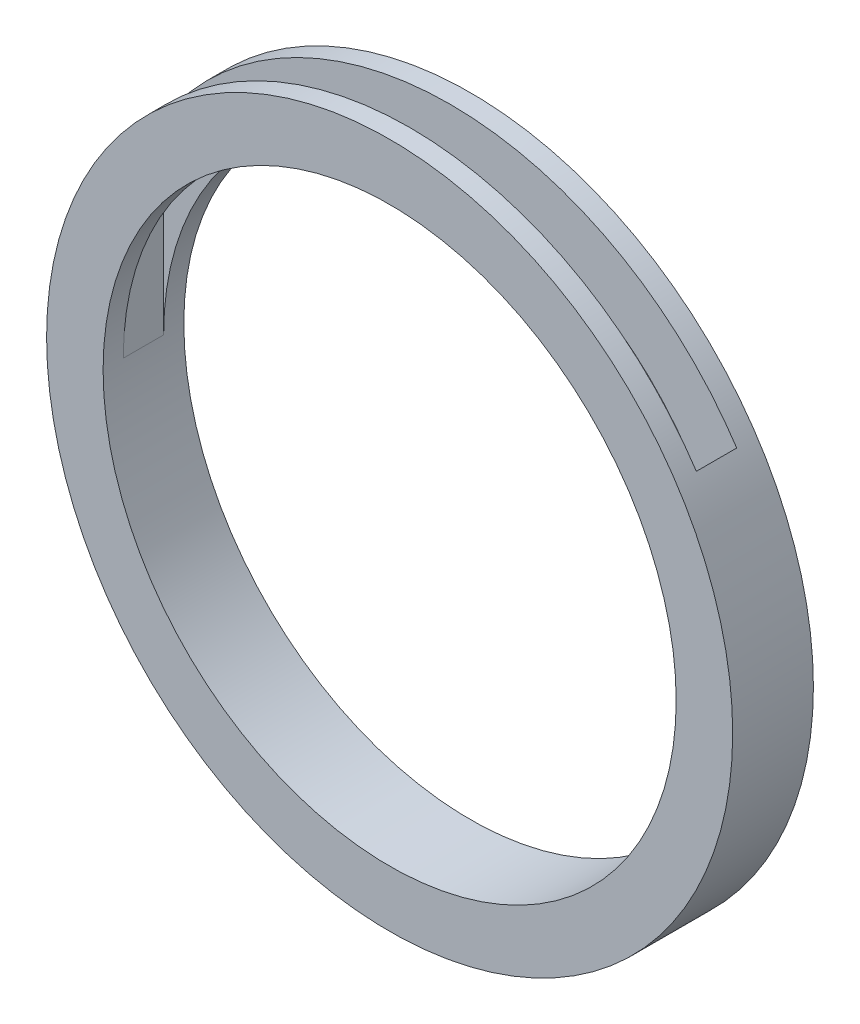
ISO-10303-21;
HEADER;
FILE_DESCRIPTION(('STEP AP214'),'2;1');
FILE_NAME('part.step','',(''),(''),'','','');
FILE_SCHEMA(('AUTOMOTIVE_DESIGN { 1 0 10303 214 1 1 1 1 }'));
ENDSEC;
DATA;
#1=APPLICATION_CONTEXT('core data for automotive mechanical design processes');
#2=APPLICATION_PROTOCOL_DEFINITION('international standard','automotive_design',2000,#1);
#3=PRODUCT_CONTEXT('',#1,'mechanical');
#4=PRODUCT('Part','Part','',(#3));
#5=PRODUCT_RELATED_PRODUCT_CATEGORY('part','',(#4));
#6=PRODUCT_DEFINITION_FORMATION('','',#4);
#7=PRODUCT_DEFINITION_CONTEXT('part definition',#1,'design');
#8=PRODUCT_DEFINITION('design','',#6,#7);
#9=PRODUCT_DEFINITION_SHAPE('','',#8);
#10=(LENGTH_UNIT() NAMED_UNIT(*) SI_UNIT(.MILLI.,.METRE.));
#11=(NAMED_UNIT(*) PLANE_ANGLE_UNIT() SI_UNIT($,.RADIAN.));
#12=(NAMED_UNIT(*) SI_UNIT($,.STERADIAN.) SOLID_ANGLE_UNIT());
#13=UNCERTAINTY_MEASURE_WITH_UNIT(LENGTH_MEASURE(1.E-05),#10,'distance_accuracy_value','');
#14=(GEOMETRIC_REPRESENTATION_CONTEXT(3) GLOBAL_UNCERTAINTY_ASSIGNED_CONTEXT((#13)) GLOBAL_UNIT_ASSIGNED_CONTEXT((#10,
#11,#12)) REPRESENTATION_CONTEXT('',''));
#15=CARTESIAN_POINT('',(0.,0.,0.));
#16=DIRECTION('',(0.,0.,1.));
#17=DIRECTION('',(1.,0.,0.));
#18=AXIS2_PLACEMENT_3D('',#15,#16,#17);
#19=CARTESIAN_POINT('',(21.59,21.59,3.81));
#20=DIRECTION('',(0.,0.,-1.));
#21=DIRECTION('',(-1.,0.,0.));
#22=AXIS2_PLACEMENT_3D('',#19,#20,#21);
#23=PLANE('',#22);
#24=CARTESIAN_POINT('',(0.,0.,3.81));
#25=DIRECTION('',(0.,0.,-1.));
#26=DIRECTION('',(-1.,0.,0.));
#27=AXIS2_PLACEMENT_3D('',#24,#25,#26);
#28=CIRCLE('',#27,21.59);
#29=CARTESIAN_POINT('',(-18.034,11.8702545886767,3.81));
#30=VERTEX_POINT('',#29);
#31=CARTESIAN_POINT('',(18.034,11.8702545886767,3.81));
#32=VERTEX_POINT('',#31);
#33=EDGE_CURVE('E56',#30,#32,#28,.T.);
#34=ORIENTED_EDGE('',*,*,#33,.T.);
#35=DIRECTION('',(0.,-1.,0.));
#36=VECTOR('',#35,1.);
#37=CARTESIAN_POINT('',(18.034,21.591,3.81));
#38=LINE('',#37,#36);
#39=CARTESIAN_POINT('',(18.034,0.,3.81));
#40=VERTEX_POINT('',#39);
#41=EDGE_CURVE('E112',#32,#40,#38,.T.);
#42=ORIENTED_EDGE('',*,*,#41,.T.);
#43=CARTESIAN_POINT('',(0.,0.,3.81));
#44=DIRECTION('',(0.,0.,-1.));
#45=DIRECTION('',(-1.,0.,0.));
#46=AXIS2_PLACEMENT_3D('',#43,#44,#45);
#47=CIRCLE('',#46,18.034);
#48=CARTESIAN_POINT('',(-18.034,0.,3.81));
#49=VERTEX_POINT('',#48);
#50=EDGE_CURVE('E41',#40,#49,#47,.F.);
#51=ORIENTED_EDGE('',*,*,#50,.T.);
#52=DIRECTION('',(0.,-1.,0.));
#53=VECTOR('',#52,1.);
#54=CARTESIAN_POINT('',(-18.034,21.591,3.81));
#55=LINE('',#54,#53);
#56=EDGE_CURVE('E81',#30,#49,#55,.T.);
#57=ORIENTED_EDGE('',*,*,#56,.F.);
#58=EDGE_LOOP('',(#34,#42,#51,#57));
#59=FACE_BOUND('',#58,.T.);
#60=ADVANCED_FACE('F33',(#59),#23,.T.);
#61=CARTESIAN_POINT('',(21.59,21.59,1.27));
#62=DIRECTION('',(0.,0.,1.));
#63=DIRECTION('',(1.,0.,0.));
#64=AXIS2_PLACEMENT_3D('',#61,#62,#63);
#65=PLANE('',#64);
#66=CARTESIAN_POINT('',(0.,0.,1.27));
#67=DIRECTION('',(0.,0.,1.));
#68=DIRECTION('',(1.,0.,0.));
#69=AXIS2_PLACEMENT_3D('',#66,#67,#68);
#70=CIRCLE('',#69,18.034);
#71=CARTESIAN_POINT('',(-18.034,0.,1.27));
#72=VERTEX_POINT('',#71);
#73=CARTESIAN_POINT('',(18.034,0.,1.27));
#74=VERTEX_POINT('',#73);
#75=EDGE_CURVE('E75',#72,#74,#70,.F.);
#76=ORIENTED_EDGE('',*,*,#75,.T.);
#77=DIRECTION('',(0.,-1.,0.));
#78=VECTOR('',#77,1.);
#79=CARTESIAN_POINT('',(18.034,21.591,1.27));
#80=LINE('',#79,#78);
#81=CARTESIAN_POINT('',(18.034,11.8702545886767,1.27));
#82=VERTEX_POINT('',#81);
#83=EDGE_CURVE('E48',#82,#74,#80,.T.);
#84=ORIENTED_EDGE('',*,*,#83,.F.);
#85=CARTESIAN_POINT('',(0.,0.,1.27));
#86=DIRECTION('',(0.,0.,1.));
#87=DIRECTION('',(1.,0.,0.));
#88=AXIS2_PLACEMENT_3D('',#85,#86,#87);
#89=CIRCLE('',#88,21.59);
#90=CARTESIAN_POINT('',(-18.034,11.8702545886767,1.27));
#91=VERTEX_POINT('',#90);
#92=EDGE_CURVE('E77',#82,#91,#89,.T.);
#93=ORIENTED_EDGE('',*,*,#92,.T.);
#94=DIRECTION('',(0.,-1.,0.));
#95=VECTOR('',#94,1.);
#96=CARTESIAN_POINT('',(-18.034,21.591,1.27));
#97=LINE('',#96,#95);
#98=EDGE_CURVE('E72',#91,#72,#97,.T.);
#99=ORIENTED_EDGE('',*,*,#98,.T.);
#100=EDGE_LOOP('',(#76,#84,#93,#99));
#101=FACE_BOUND('',#100,.T.);
#102=ADVANCED_FACE('F74',(#101),#65,.T.);
#103=CARTESIAN_POINT('',(0.,0.,5.08));
#104=DIRECTION('',(0.,0.,-1.));
#105=DIRECTION('',(-1.,0.,0.));
#106=AXIS2_PLACEMENT_3D('',#103,#104,#105);
#107=CYLINDRICAL_SURFACE('',#106,21.59);
#108=ORIENTED_EDGE('',*,*,#92,.F.);
#109=DIRECTION('',(0.,0.,-1.));
#110=VECTOR('',#109,1.);
#111=CARTESIAN_POINT('',(18.034,11.8702545886767,5.08));
#112=LINE('',#111,#110);
#113=EDGE_CURVE('E82',#32,#82,#112,.T.);
#114=ORIENTED_EDGE('',*,*,#113,.F.);
#115=ORIENTED_EDGE('',*,*,#33,.F.);
#116=DIRECTION('',(0.,0.,-1.));
#117=VECTOR('',#116,1.);
#118=CARTESIAN_POINT('',(-18.034,11.8702545886767,5.08));
#119=LINE('',#118,#117);
#120=EDGE_CURVE('E93',#91,#30,#119,.F.);
#121=ORIENTED_EDGE('',*,*,#120,.F.);
#122=EDGE_LOOP('',(#108,#114,#115,#121));
#123=FACE_BOUND('',#122,.T.);
#124=CARTESIAN_POINT('',(0.,0.,0.));
#125=DIRECTION('',(0.,0.,1.));
#126=DIRECTION('',(1.,0.,0.));
#127=AXIS2_PLACEMENT_3D('',#124,#125,#126);
#128=CIRCLE('',#127,21.59);
#129=CARTESIAN_POINT('',(21.59,0.,0.));
#130=VERTEX_POINT('',#129);
#131=EDGE_CURVE('E103',#130,#130,#128,.T.);
#132=ORIENTED_EDGE('',*,*,#131,.T.);
#133=EDGE_LOOP('',(#132));
#134=FACE_BOUND('',#133,.T.);
#135=CARTESIAN_POINT('',(0.,0.,5.08));
#136=DIRECTION('',(0.,0.,1.));
#137=DIRECTION('',(1.,0.,0.));
#138=AXIS2_PLACEMENT_3D('',#135,#136,#137);
#139=CIRCLE('',#138,21.59);
#140=CARTESIAN_POINT('',(21.59,0.,5.08));
#141=VERTEX_POINT('',#140);
#142=EDGE_CURVE('E106',#141,#141,#139,.T.);
#143=ORIENTED_EDGE('',*,*,#142,.F.);
#144=EDGE_LOOP('',(#143));
#145=FACE_BOUND('',#144,.T.);
#146=ADVANCED_FACE('F35',(#123,#134,#145),#107,.T.);
#147=CARTESIAN_POINT('',(0.,0.,0.));
#148=DIRECTION('',(0.,0.,1.));
#149=DIRECTION('',(1.,0.,0.));
#150=AXIS2_PLACEMENT_3D('',#147,#148,#149);
#151=CYLINDRICAL_SURFACE('',#150,18.034);
#152=CARTESIAN_POINT('',(0.,0.,5.08));
#153=DIRECTION('',(0.,0.,1.));
#154=DIRECTION('',(1.,0.,0.));
#155=AXIS2_PLACEMENT_3D('',#152,#153,#154);
#156=CIRCLE('',#155,18.034);
#157=CARTESIAN_POINT('',(18.034,0.,5.08));
#158=VERTEX_POINT('',#157);
#159=EDGE_CURVE('E99',#158,#158,#156,.T.);
#160=ORIENTED_EDGE('',*,*,#159,.T.);
#161=EDGE_LOOP('',(#160));
#162=FACE_BOUND('',#161,.T.);
#163=CARTESIAN_POINT('',(0.,0.,0.));
#164=DIRECTION('',(0.,0.,1.));
#165=DIRECTION('',(1.,0.,0.));
#166=AXIS2_PLACEMENT_3D('',#163,#164,#165);
#167=CIRCLE('',#166,18.034);
#168=CARTESIAN_POINT('',(18.034,0.,0.));
#169=VERTEX_POINT('',#168);
#170=EDGE_CURVE('E100',#169,#169,#167,.T.);
#171=ORIENTED_EDGE('',*,*,#170,.F.);
#172=EDGE_LOOP('',(#171));
#173=FACE_BOUND('',#172,.T.);
#174=DIRECTION('',(0.,0.,1.));
#175=VECTOR('',#174,1.);
#176=CARTESIAN_POINT('',(-18.034,0.,0.));
#177=LINE('',#176,#175);
#178=EDGE_CURVE('E11',#49,#72,#177,.F.);
#179=ORIENTED_EDGE('',*,*,#178,.F.);
#180=ORIENTED_EDGE('',*,*,#50,.F.);
#181=DIRECTION('',(0.,0.,1.));
#182=VECTOR('',#181,1.);
#183=CARTESIAN_POINT('',(18.034,0.,0.));
#184=LINE('',#183,#182);
#185=EDGE_CURVE('E90',#74,#40,#184,.T.);
#186=ORIENTED_EDGE('',*,*,#185,.F.);
#187=ORIENTED_EDGE('',*,*,#75,.F.);
#188=EDGE_LOOP('',(#179,#180,#186,#187));
#189=FACE_BOUND('',#188,.T.);
#190=ADVANCED_FACE('F86',(#162,#173,#189),#151,.F.);
#191=CARTESIAN_POINT('',(0.,0.,5.08));
#192=DIRECTION('',(0.,0.,1.));
#193=DIRECTION('',(1.,0.,0.));
#194=AXIS2_PLACEMENT_3D('',#191,#192,#193);
#195=PLANE('',#194);
#196=ORIENTED_EDGE('',*,*,#159,.F.);
#197=EDGE_LOOP('',(#196));
#198=FACE_BOUND('',#197,.T.);
#199=ORIENTED_EDGE('',*,*,#142,.T.);
#200=EDGE_LOOP('',(#199));
#201=FACE_BOUND('',#200,.T.);
#202=ADVANCED_FACE('F126',(#198,#201),#195,.T.);
#203=CARTESIAN_POINT('',(0.,0.,0.));
#204=DIRECTION('',(0.,0.,1.));
#205=DIRECTION('',(1.,0.,0.));
#206=AXIS2_PLACEMENT_3D('',#203,#204,#205);
#207=PLANE('',#206);
#208=ORIENTED_EDGE('',*,*,#170,.T.);
#209=EDGE_LOOP('',(#208));
#210=FACE_BOUND('',#209,.T.);
#211=ORIENTED_EDGE('',*,*,#131,.F.);
#212=EDGE_LOOP('',(#211));
#213=FACE_BOUND('',#212,.T.);
#214=ADVANCED_FACE('F128',(#210,#213),#207,.F.);
#215=CARTESIAN_POINT('',(-18.034,21.591,3.81));
#216=DIRECTION('',(-1.,0.,0.));
#217=DIRECTION('',(0.,0.,1.));
#218=AXIS2_PLACEMENT_3D('',#215,#216,#217);
#219=PLANE('',#218);
#220=ORIENTED_EDGE('',*,*,#98,.F.);
#221=ORIENTED_EDGE('',*,*,#120,.T.);
#222=ORIENTED_EDGE('',*,*,#56,.T.);
#223=ORIENTED_EDGE('',*,*,#178,.T.);
#224=EDGE_LOOP('',(#220,#221,#222,#223));
#225=FACE_BOUND('',#224,.T.);
#226=ADVANCED_FACE('F92',(#225),#219,.F.);
#227=CARTESIAN_POINT('',(18.034,21.591,1.27));
#228=DIRECTION('',(1.,0.,0.));
#229=DIRECTION('',(0.,0.,-1.));
#230=AXIS2_PLACEMENT_3D('',#227,#228,#229);
#231=PLANE('',#230);
#232=ORIENTED_EDGE('',*,*,#41,.F.);
#233=ORIENTED_EDGE('',*,*,#113,.T.);
#234=ORIENTED_EDGE('',*,*,#83,.T.);
#235=ORIENTED_EDGE('',*,*,#185,.T.);
#236=EDGE_LOOP('',(#232,#233,#234,#235));
#237=FACE_BOUND('',#236,.T.);
#238=ADVANCED_FACE('F114',(#237),#231,.F.);
#239=CLOSED_SHELL('',(#60,#102,#146,#190,#202,#214,#226,#238));
#240=MANIFOLD_SOLID_BREP('B2',#239);
#241=ADVANCED_BREP_SHAPE_REPRESENTATION('',(#18,#240),#14);
#242=SHAPE_DEFINITION_REPRESENTATION(#9,#241);
ENDSEC;
END-ISO-10303-21;
